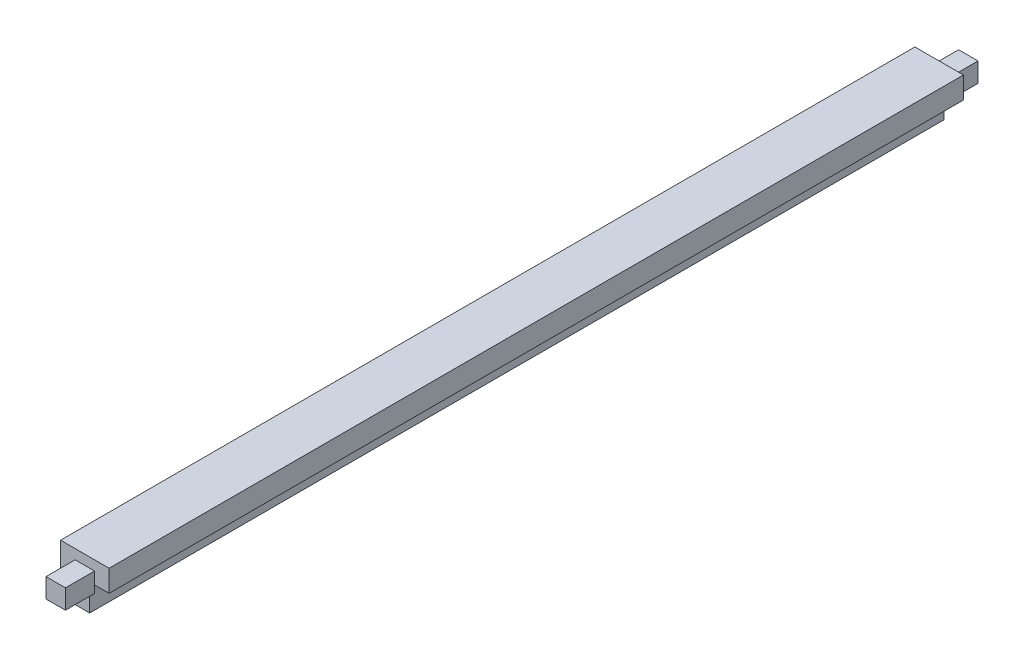
ISO-10303-21;
HEADER;
FILE_DESCRIPTION(('STEP AP214'),'2;1');
FILE_NAME('part.step','',(''),(''),'','','');
FILE_SCHEMA(('AUTOMOTIVE_DESIGN { 1 0 10303 214 1 1 1 1 }'));
ENDSEC;
DATA;
#1=APPLICATION_CONTEXT('core data for automotive mechanical design processes');
#2=APPLICATION_PROTOCOL_DEFINITION('international standard','automotive_design',2000,#1);
#3=PRODUCT_CONTEXT('',#1,'mechanical');
#4=PRODUCT('Part','Part','',(#3));
#5=PRODUCT_RELATED_PRODUCT_CATEGORY('part','',(#4));
#6=PRODUCT_DEFINITION_FORMATION('','',#4);
#7=PRODUCT_DEFINITION_CONTEXT('part definition',#1,'design');
#8=PRODUCT_DEFINITION('design','',#6,#7);
#9=PRODUCT_DEFINITION_SHAPE('','',#8);
#10=(LENGTH_UNIT() NAMED_UNIT(*) SI_UNIT(.MILLI.,.METRE.));
#11=(NAMED_UNIT(*) PLANE_ANGLE_UNIT() SI_UNIT($,.RADIAN.));
#12=(NAMED_UNIT(*) SI_UNIT($,.STERADIAN.) SOLID_ANGLE_UNIT());
#13=UNCERTAINTY_MEASURE_WITH_UNIT(LENGTH_MEASURE(1.E-05),#10,'distance_accuracy_value','');
#14=(GEOMETRIC_REPRESENTATION_CONTEXT(3) GLOBAL_UNCERTAINTY_ASSIGNED_CONTEXT((#13)) GLOBAL_UNIT_ASSIGNED_CONTEXT((#10,
#11,#12)) REPRESENTATION_CONTEXT('',''));
#15=CARTESIAN_POINT('',(0.,0.,0.));
#16=DIRECTION('',(0.,0.,1.));
#17=DIRECTION('',(1.,0.,0.));
#18=AXIS2_PLACEMENT_3D('',#15,#16,#17);
#19=CARTESIAN_POINT('',(-38.944928994695,5.,-32.0723360080208));
#20=DIRECTION('',(0.,0.,1.));
#21=DIRECTION('',(1.,0.,0.));
#22=AXIS2_PLACEMENT_3D('',#19,#20,#21);
#23=PLANE('',#22);
#24=DIRECTION('',(-1.,0.,0.));
#25=VECTOR('',#24,1.);
#26=CARTESIAN_POINT('',(-37.444928994695,2.,-32.0723360080208));
#27=LINE('',#26,#25);
#28=CARTESIAN_POINT('',(-35.944928994695,2.,-32.0723360080208));
#29=VERTEX_POINT('',#28);
#30=CARTESIAN_POINT('',(-37.444928994695,2.,-32.0723360080208));
#31=VERTEX_POINT('',#30);
#32=EDGE_CURVE('E55',#29,#31,#27,.T.);
#33=ORIENTED_EDGE('',*,*,#32,.F.);
#34=DIRECTION('',(0.,-1.,0.));
#35=VECTOR('',#34,1.);
#36=CARTESIAN_POINT('',(-35.944928994695,2.762,-32.0723360080208));
#37=LINE('',#36,#35);
#38=CARTESIAN_POINT('',(-35.944928994695,0.,-32.0723360080208));
#39=VERTEX_POINT('',#38);
#40=EDGE_CURVE('E268',#29,#39,#37,.T.);
#41=ORIENTED_EDGE('',*,*,#40,.T.);
#42=DIRECTION('',(-1.,0.,0.));
#43=VECTOR('',#42,1.);
#44=CARTESIAN_POINT('',(-38.944928994695,0.,-32.0723360080208));
#45=LINE('',#44,#43);
#46=CARTESIAN_POINT('',(-38.944928994695,0.,-32.0723360080208));
#47=VERTEX_POINT('',#46);
#48=EDGE_CURVE('E181',#39,#47,#45,.T.);
#49=ORIENTED_EDGE('',*,*,#48,.T.);
#50=DIRECTION('',(0.,-1.,0.));
#51=VECTOR('',#50,1.);
#52=CARTESIAN_POINT('',(-38.944928994695,5.,-32.0723360080208));
#53=LINE('',#52,#51);
#54=CARTESIAN_POINT('',(-38.944928994695,5.,-32.0723360080208));
#55=VERTEX_POINT('',#54);
#56=EDGE_CURVE('E175',#55,#47,#53,.T.);
#57=ORIENTED_EDGE('',*,*,#56,.F.);
#58=DIRECTION('',(-1.,0.,0.));
#59=VECTOR('',#58,1.);
#60=CARTESIAN_POINT('',(-38.944928994695,5.,-32.0723360080208));
#61=LINE('',#60,#59);
#62=CARTESIAN_POINT('',(-33.944928994695,5.,-32.0723360080208));
#63=VERTEX_POINT('',#62);
#64=EDGE_CURVE('E180',#63,#55,#61,.T.);
#65=ORIENTED_EDGE('',*,*,#64,.F.);
#66=DIRECTION('',(0.,-1.,0.));
#67=VECTOR('',#66,1.);
#68=CARTESIAN_POINT('',(-33.944928994695,5.,-32.0723360080208));
#69=LINE('',#68,#67);
#70=CARTESIAN_POINT('',(-33.944928994695,2.762,-32.0723360080208));
#71=VERTEX_POINT('',#70);
#72=EDGE_CURVE('E174',#63,#71,#69,.T.);
#73=ORIENTED_EDGE('',*,*,#72,.T.);
#74=DIRECTION('',(1.,0.,0.));
#75=VECTOR('',#74,1.);
#76=CARTESIAN_POINT('',(-33.944928994695,2.762,-32.0723360080208));
#77=LINE('',#76,#75);
#78=CARTESIAN_POINT('',(-35.444928994695,2.762,-32.0723360080208));
#79=VERTEX_POINT('',#78);
#80=EDGE_CURVE('E154',#79,#71,#77,.T.);
#81=ORIENTED_EDGE('',*,*,#80,.F.);
#82=DIRECTION('',(0.,-1.,0.));
#83=VECTOR('',#82,1.);
#84=CARTESIAN_POINT('',(-35.444928994695,4.,-32.0723360080208));
#85=LINE('',#84,#83);
#86=CARTESIAN_POINT('',(-35.444928994695,4.,-32.0723360080208));
#87=VERTEX_POINT('',#86);
#88=EDGE_CURVE('E243',#87,#79,#85,.T.);
#89=ORIENTED_EDGE('',*,*,#88,.F.);
#90=DIRECTION('',(1.,0.,0.));
#91=VECTOR('',#90,1.);
#92=CARTESIAN_POINT('',(-37.444928994695,4.,-32.0723360080208));
#93=LINE('',#92,#91);
#94=CARTESIAN_POINT('',(-37.444928994695,4.,-32.0723360080208));
#95=VERTEX_POINT('',#94);
#96=EDGE_CURVE('E246',#95,#87,#93,.T.);
#97=ORIENTED_EDGE('',*,*,#96,.F.);
#98=DIRECTION('',(0.,1.,0.));
#99=VECTOR('',#98,1.);
#100=CARTESIAN_POINT('',(-37.444928994695,4.,-32.0723360080208));
#101=LINE('',#100,#99);
#102=EDGE_CURVE('E249',#31,#95,#101,.T.);
#103=ORIENTED_EDGE('',*,*,#102,.F.);
#104=EDGE_LOOP('',(#33,#41,#49,#57,#65,#73,#81,#89,#97,#103));
#105=FACE_BOUND('',#104,.T.);
#106=ADVANCED_FACE('F32',(#105),#23,.F.);
#107=CARTESIAN_POINT('',(-38.944928994695,5.,55.9276639919792));
#108=DIRECTION('',(0.,0.,-1.));
#109=DIRECTION('',(-1.,0.,0.));
#110=AXIS2_PLACEMENT_3D('',#107,#108,#109);
#111=PLANE('',#110);
#112=DIRECTION('',(1.,0.,0.));
#113=VECTOR('',#112,1.);
#114=CARTESIAN_POINT('',(-38.944928994695,0.,55.9276639919792));
#115=LINE('',#114,#113);
#116=CARTESIAN_POINT('',(-38.944928994695,0.,55.9276639919792));
#117=VERTEX_POINT('',#116);
#118=CARTESIAN_POINT('',(-35.944928994695,0.,55.9276639919792));
#119=VERTEX_POINT('',#118);
#120=EDGE_CURVE('E184',#117,#119,#115,.T.);
#121=ORIENTED_EDGE('',*,*,#120,.T.);
#122=DIRECTION('',(0.,-1.,0.));
#123=VECTOR('',#122,1.);
#124=CARTESIAN_POINT('',(-35.944928994695,2.762,55.9276639919792));
#125=LINE('',#124,#123);
#126=CARTESIAN_POINT('',(-35.944928994695,2.,55.9276639919792));
#127=VERTEX_POINT('',#126);
#128=EDGE_CURVE('E269',#127,#119,#125,.T.);
#129=ORIENTED_EDGE('',*,*,#128,.F.);
#130=DIRECTION('',(1.,0.,0.));
#131=VECTOR('',#130,1.);
#132=CARTESIAN_POINT('',(-37.444928994695,2.,55.9276639919792));
#133=LINE('',#132,#131);
#134=CARTESIAN_POINT('',(-37.444928994695,2.,55.9276639919792));
#135=VERTEX_POINT('',#134);
#136=EDGE_CURVE('E214',#135,#127,#133,.T.);
#137=ORIENTED_EDGE('',*,*,#136,.F.);
#138=DIRECTION('',(0.,-1.,0.));
#139=VECTOR('',#138,1.);
#140=CARTESIAN_POINT('',(-37.444928994695,4.,55.9276639919792));
#141=LINE('',#140,#139);
#142=CARTESIAN_POINT('',(-37.444928994695,4.,55.9276639919792));
#143=VERTEX_POINT('',#142);
#144=EDGE_CURVE('E217',#143,#135,#141,.T.);
#145=ORIENTED_EDGE('',*,*,#144,.F.);
#146=DIRECTION('',(-1.,0.,0.));
#147=VECTOR('',#146,1.);
#148=CARTESIAN_POINT('',(-37.444928994695,4.,55.9276639919792));
#149=LINE('',#148,#147);
#150=CARTESIAN_POINT('',(-35.444928994695,4.,55.9276639919792));
#151=VERTEX_POINT('',#150);
#152=EDGE_CURVE('E208',#151,#143,#149,.T.);
#153=ORIENTED_EDGE('',*,*,#152,.F.);
#154=DIRECTION('',(0.,1.,0.));
#155=VECTOR('',#154,1.);
#156=CARTESIAN_POINT('',(-35.444928994695,4.,55.9276639919792));
#157=LINE('',#156,#155);
#158=CARTESIAN_POINT('',(-35.444928994695,2.762,55.9276639919792));
#159=VERTEX_POINT('',#158);
#160=EDGE_CURVE('E168',#159,#151,#157,.T.);
#161=ORIENTED_EDGE('',*,*,#160,.F.);
#162=DIRECTION('',(-1.,0.,0.));
#163=VECTOR('',#162,1.);
#164=CARTESIAN_POINT('',(-33.944928994695,2.762,55.9276639919792));
#165=LINE('',#164,#163);
#166=CARTESIAN_POINT('',(-33.944928994695,2.762,55.9276639919792));
#167=VERTEX_POINT('',#166);
#168=EDGE_CURVE('E150',#167,#159,#165,.T.);
#169=ORIENTED_EDGE('',*,*,#168,.F.);
#170=DIRECTION('',(0.,-1.,0.));
#171=VECTOR('',#170,1.);
#172=CARTESIAN_POINT('',(-33.944928994695,5.,55.9276639919792));
#173=LINE('',#172,#171);
#174=CARTESIAN_POINT('',(-33.944928994695,5.,55.9276639919792));
#175=VERTEX_POINT('',#174);
#176=EDGE_CURVE('E40',#175,#167,#173,.T.);
#177=ORIENTED_EDGE('',*,*,#176,.F.);
#178=DIRECTION('',(1.,0.,0.));
#179=VECTOR('',#178,1.);
#180=CARTESIAN_POINT('',(-38.944928994695,5.,55.9276639919792));
#181=LINE('',#180,#179);
#182=CARTESIAN_POINT('',(-38.944928994695,5.,55.9276639919792));
#183=VERTEX_POINT('',#182);
#184=EDGE_CURVE('E192',#183,#175,#181,.T.);
#185=ORIENTED_EDGE('',*,*,#184,.F.);
#186=DIRECTION('',(0.,-1.,0.));
#187=VECTOR('',#186,1.);
#188=CARTESIAN_POINT('',(-38.944928994695,5.,55.9276639919792));
#189=LINE('',#188,#187);
#190=EDGE_CURVE('E11',#183,#117,#189,.T.);
#191=ORIENTED_EDGE('',*,*,#190,.T.);
#192=EDGE_LOOP('',(#121,#129,#137,#145,#153,#161,#169,#177,#185,#191));
#193=FACE_BOUND('',#192,.T.);
#194=ADVANCED_FACE('F165',(#193),#111,.F.);
#195=CARTESIAN_POINT('',(-38.944928994695,5.,-32.0723360080208));
#196=DIRECTION('',(1.,0.,0.));
#197=DIRECTION('',(0.,0.,-1.));
#198=AXIS2_PLACEMENT_3D('',#195,#196,#197);
#199=PLANE('',#198);
#200=DIRECTION('',(0.,0.,1.));
#201=VECTOR('',#200,1.);
#202=CARTESIAN_POINT('',(-38.944928994695,0.,-32.0723360080208));
#203=LINE('',#202,#201);
#204=EDGE_CURVE('E186',#47,#117,#203,.T.);
#205=ORIENTED_EDGE('',*,*,#204,.T.);
#206=ORIENTED_EDGE('',*,*,#190,.F.);
#207=DIRECTION('',(0.,0.,1.));
#208=VECTOR('',#207,1.);
#209=CARTESIAN_POINT('',(-38.944928994695,5.,-32.0723360080208));
#210=LINE('',#209,#208);
#211=EDGE_CURVE('E183',#55,#183,#210,.T.);
#212=ORIENTED_EDGE('',*,*,#211,.F.);
#213=ORIENTED_EDGE('',*,*,#56,.T.);
#214=EDGE_LOOP('',(#205,#206,#212,#213));
#215=FACE_BOUND('',#214,.T.);
#216=ADVANCED_FACE('F34',(#215),#199,.F.);
#217=CARTESIAN_POINT('',(-33.944928994695,5.,-32.0723360080208));
#218=DIRECTION('',(-1.,0.,0.));
#219=DIRECTION('',(0.,0.,1.));
#220=AXIS2_PLACEMENT_3D('',#217,#218,#219);
#221=PLANE('',#220);
#222=ORIENTED_EDGE('',*,*,#176,.T.);
#223=DIRECTION('',(0.,0.,1.));
#224=VECTOR('',#223,1.);
#225=CARTESIAN_POINT('',(-33.944928994695,2.762,55.9276639919792));
#226=LINE('',#225,#224);
#227=EDGE_CURVE('E147',#71,#167,#226,.T.);
#228=ORIENTED_EDGE('',*,*,#227,.F.);
#229=ORIENTED_EDGE('',*,*,#72,.F.);
#230=DIRECTION('',(0.,0.,-1.));
#231=VECTOR('',#230,1.);
#232=CARTESIAN_POINT('',(-33.944928994695,5.,-32.0723360080208));
#233=LINE('',#232,#231);
#234=EDGE_CURVE('E173',#175,#63,#233,.T.);
#235=ORIENTED_EDGE('',*,*,#234,.F.);
#236=EDGE_LOOP('',(#222,#228,#229,#235));
#237=FACE_BOUND('',#236,.T.);
#238=ADVANCED_FACE('F172',(#237),#221,.F.);
#239=CARTESIAN_POINT('',(0.,5.,0.));
#240=DIRECTION('',(0.,1.,0.));
#241=DIRECTION('',(0.,0.,1.));
#242=AXIS2_PLACEMENT_3D('',#239,#240,#241);
#243=PLANE('',#242);
#244=ORIENTED_EDGE('',*,*,#211,.T.);
#245=ORIENTED_EDGE('',*,*,#184,.T.);
#246=ORIENTED_EDGE('',*,*,#234,.T.);
#247=ORIENTED_EDGE('',*,*,#64,.T.);
#248=EDGE_LOOP('',(#244,#245,#246,#247));
#249=FACE_BOUND('',#248,.T.);
#250=ADVANCED_FACE('F297',(#249),#243,.T.);
#251=CARTESIAN_POINT('',(0.,0.,0.));
#252=DIRECTION('',(0.,1.,0.));
#253=DIRECTION('',(0.,0.,1.));
#254=AXIS2_PLACEMENT_3D('',#251,#252,#253);
#255=PLANE('',#254);
#256=ORIENTED_EDGE('',*,*,#48,.F.);
#257=DIRECTION('',(0.,0.,-1.));
#258=VECTOR('',#257,1.);
#259=CARTESIAN_POINT('',(-35.944928994695,0.,55.9276639919792));
#260=LINE('',#259,#258);
#261=EDGE_CURVE('E160',#119,#39,#260,.T.);
#262=ORIENTED_EDGE('',*,*,#261,.F.);
#263=ORIENTED_EDGE('',*,*,#120,.F.);
#264=ORIENTED_EDGE('',*,*,#204,.F.);
#265=EDGE_LOOP('',(#256,#262,#263,#264));
#266=FACE_BOUND('',#265,.T.);
#267=ADVANCED_FACE('F304',(#266),#255,.F.);
#268=CARTESIAN_POINT('',(-37.444928994695,4.,58.9276639919792));
#269=DIRECTION('',(1.,0.,0.));
#270=DIRECTION('',(0.,0.,-1.));
#271=AXIS2_PLACEMENT_3D('',#268,#269,#270);
#272=PLANE('',#271);
#273=ORIENTED_EDGE('',*,*,#144,.T.);
#274=DIRECTION('',(0.,0.,-1.));
#275=VECTOR('',#274,1.);
#276=CARTESIAN_POINT('',(-37.444928994695,2.,58.9276639919792));
#277=LINE('',#276,#275);
#278=CARTESIAN_POINT('',(-37.444928994695,2.,58.9276639919792));
#279=VERTEX_POINT('',#278);
#280=EDGE_CURVE('E189',#279,#135,#277,.T.);
#281=ORIENTED_EDGE('',*,*,#280,.F.);
#282=DIRECTION('',(0.,-1.,0.));
#283=VECTOR('',#282,1.);
#284=CARTESIAN_POINT('',(-37.444928994695,4.,58.9276639919792));
#285=LINE('',#284,#283);
#286=CARTESIAN_POINT('',(-37.444928994695,4.,58.9276639919792));
#287=VERTEX_POINT('',#286);
#288=EDGE_CURVE('E211',#287,#279,#285,.T.);
#289=ORIENTED_EDGE('',*,*,#288,.F.);
#290=DIRECTION('',(0.,0.,-1.));
#291=VECTOR('',#290,1.);
#292=CARTESIAN_POINT('',(-37.444928994695,4.,58.9276639919792));
#293=LINE('',#292,#291);
#294=EDGE_CURVE('E204',#287,#143,#293,.T.);
#295=ORIENTED_EDGE('',*,*,#294,.T.);
#296=EDGE_LOOP('',(#273,#281,#289,#295));
#297=FACE_BOUND('',#296,.T.);
#298=ADVANCED_FACE('F314',(#297),#272,.F.);
#299=CARTESIAN_POINT('',(-37.444928994695,2.,58.9276639919792));
#300=DIRECTION('',(0.,1.,0.));
#301=DIRECTION('',(0.,0.,1.));
#302=AXIS2_PLACEMENT_3D('',#299,#300,#301);
#303=PLANE('',#302);
#304=ORIENTED_EDGE('',*,*,#136,.T.);
#305=DIRECTION('',(1.,0.,0.));
#306=VECTOR('',#305,1.);
#307=CARTESIAN_POINT('',(-37.444928994695,2.,55.9276639919792));
#308=LINE('',#307,#306);
#309=CARTESIAN_POINT('',(-35.444928994695,2.,55.9276639919792));
#310=VERTEX_POINT('',#309);
#311=EDGE_CURVE('E252',#127,#310,#308,.T.);
#312=ORIENTED_EDGE('',*,*,#311,.T.);
#313=DIRECTION('',(0.,0.,-1.));
#314=VECTOR('',#313,1.);
#315=CARTESIAN_POINT('',(-35.444928994695,2.,58.9276639919792));
#316=LINE('',#315,#314);
#317=CARTESIAN_POINT('',(-35.444928994695,2.,58.9276639919792));
#318=VERTEX_POINT('',#317);
#319=EDGE_CURVE('E198',#318,#310,#316,.T.);
#320=ORIENTED_EDGE('',*,*,#319,.F.);
#321=DIRECTION('',(1.,0.,0.));
#322=VECTOR('',#321,1.);
#323=CARTESIAN_POINT('',(-37.444928994695,2.,58.9276639919792));
#324=LINE('',#323,#322);
#325=EDGE_CURVE('E224',#279,#318,#324,.T.);
#326=ORIENTED_EDGE('',*,*,#325,.F.);
#327=ORIENTED_EDGE('',*,*,#280,.T.);
#328=EDGE_LOOP('',(#304,#312,#320,#326,#327));
#329=FACE_BOUND('',#328,.T.);
#330=ADVANCED_FACE('F309',(#329),#303,.F.);
#331=CARTESIAN_POINT('',(-35.444928994695,4.,58.9276639919792));
#332=DIRECTION('',(-1.,0.,0.));
#333=DIRECTION('',(0.,0.,1.));
#334=AXIS2_PLACEMENT_3D('',#331,#332,#333);
#335=PLANE('',#334);
#336=EDGE_CURVE('E212',#310,#159,#157,.T.);
#337=ORIENTED_EDGE('',*,*,#336,.T.);
#338=ORIENTED_EDGE('',*,*,#160,.T.);
#339=DIRECTION('',(0.,0.,-1.));
#340=VECTOR('',#339,1.);
#341=CARTESIAN_POINT('',(-35.444928994695,4.,58.9276639919792));
#342=LINE('',#341,#340);
#343=CARTESIAN_POINT('',(-35.444928994695,4.,58.9276639919792));
#344=VERTEX_POINT('',#343);
#345=EDGE_CURVE('E201',#344,#151,#342,.T.);
#346=ORIENTED_EDGE('',*,*,#345,.F.);
#347=DIRECTION('',(0.,1.,0.));
#348=VECTOR('',#347,1.);
#349=CARTESIAN_POINT('',(-35.444928994695,4.,58.9276639919792));
#350=LINE('',#349,#348);
#351=EDGE_CURVE('E222',#318,#344,#350,.T.);
#352=ORIENTED_EDGE('',*,*,#351,.F.);
#353=ORIENTED_EDGE('',*,*,#319,.T.);
#354=EDGE_LOOP('',(#337,#338,#346,#352,#353));
#355=FACE_BOUND('',#354,.T.);
#356=ADVANCED_FACE('F322',(#355),#335,.F.);
#357=CARTESIAN_POINT('',(-37.444928994695,4.,58.9276639919792));
#358=DIRECTION('',(0.,-1.,0.));
#359=DIRECTION('',(0.,0.,-1.));
#360=AXIS2_PLACEMENT_3D('',#357,#358,#359);
#361=PLANE('',#360);
#362=ORIENTED_EDGE('',*,*,#152,.T.);
#363=ORIENTED_EDGE('',*,*,#294,.F.);
#364=DIRECTION('',(-1.,0.,0.));
#365=VECTOR('',#364,1.);
#366=CARTESIAN_POINT('',(-37.444928994695,4.,58.9276639919792));
#367=LINE('',#366,#365);
#368=EDGE_CURVE('E207',#344,#287,#367,.T.);
#369=ORIENTED_EDGE('',*,*,#368,.F.);
#370=ORIENTED_EDGE('',*,*,#345,.T.);
#371=EDGE_LOOP('',(#362,#363,#369,#370));
#372=FACE_BOUND('',#371,.T.);
#373=ADVANCED_FACE('F317',(#372),#361,.F.);
#374=CARTESIAN_POINT('',(0.,0.,58.9276639919792));
#375=DIRECTION('',(0.,0.,1.));
#376=DIRECTION('',(1.,0.,0.));
#377=AXIS2_PLACEMENT_3D('',#374,#375,#376);
#378=PLANE('',#377);
#379=ORIENTED_EDGE('',*,*,#288,.T.);
#380=ORIENTED_EDGE('',*,*,#325,.T.);
#381=ORIENTED_EDGE('',*,*,#351,.T.);
#382=ORIENTED_EDGE('',*,*,#368,.T.);
#383=EDGE_LOOP('',(#379,#380,#381,#382));
#384=FACE_BOUND('',#383,.T.);
#385=ADVANCED_FACE('F453',(#384),#378,.T.);
#386=CARTESIAN_POINT('',(-37.444928994695,4.,-35.0723360080208));
#387=DIRECTION('',(1.,0.,0.));
#388=DIRECTION('',(0.,0.,-1.));
#389=AXIS2_PLACEMENT_3D('',#386,#387,#388);
#390=PLANE('',#389);
#391=ORIENTED_EDGE('',*,*,#102,.T.);
#392=DIRECTION('',(0.,0.,1.));
#393=VECTOR('',#392,1.);
#394=CARTESIAN_POINT('',(-37.444928994695,4.,-35.0723360080208));
#395=LINE('',#394,#393);
#396=CARTESIAN_POINT('',(-37.444928994695,4.,-35.0723360080208));
#397=VERTEX_POINT('',#396);
#398=EDGE_CURVE('E220',#397,#95,#395,.T.);
#399=ORIENTED_EDGE('',*,*,#398,.F.);
#400=DIRECTION('',(0.,1.,0.));
#401=VECTOR('',#400,1.);
#402=CARTESIAN_POINT('',(-37.444928994695,4.,-35.0723360080208));
#403=LINE('',#402,#401);
#404=CARTESIAN_POINT('',(-37.444928994695,2.,-35.0723360080208));
#405=VERTEX_POINT('',#404);
#406=EDGE_CURVE('E242',#405,#397,#403,.T.);
#407=ORIENTED_EDGE('',*,*,#406,.F.);
#408=DIRECTION('',(0.,0.,1.));
#409=VECTOR('',#408,1.);
#410=CARTESIAN_POINT('',(-37.444928994695,2.,-35.0723360080208));
#411=LINE('',#410,#409);
#412=EDGE_CURVE('E236',#405,#31,#411,.T.);
#413=ORIENTED_EDGE('',*,*,#412,.T.);
#414=EDGE_LOOP('',(#391,#399,#407,#413));
#415=FACE_BOUND('',#414,.T.);
#416=ADVANCED_FACE('F444',(#415),#390,.F.);
#417=CARTESIAN_POINT('',(-37.444928994695,4.,-35.0723360080208));
#418=DIRECTION('',(0.,-1.,0.));
#419=DIRECTION('',(0.,0.,-1.));
#420=AXIS2_PLACEMENT_3D('',#417,#418,#419);
#421=PLANE('',#420);
#422=ORIENTED_EDGE('',*,*,#96,.T.);
#423=DIRECTION('',(0.,0.,1.));
#424=VECTOR('',#423,1.);
#425=CARTESIAN_POINT('',(-35.444928994695,4.,-35.0723360080208));
#426=LINE('',#425,#424);
#427=CARTESIAN_POINT('',(-35.444928994695,4.,-35.0723360080208));
#428=VERTEX_POINT('',#427);
#429=EDGE_CURVE('E230',#428,#87,#426,.T.);
#430=ORIENTED_EDGE('',*,*,#429,.F.);
#431=DIRECTION('',(1.,0.,0.));
#432=VECTOR('',#431,1.);
#433=CARTESIAN_POINT('',(-37.444928994695,4.,-35.0723360080208));
#434=LINE('',#433,#432);
#435=EDGE_CURVE('E256',#397,#428,#434,.T.);
#436=ORIENTED_EDGE('',*,*,#435,.F.);
#437=ORIENTED_EDGE('',*,*,#398,.T.);
#438=EDGE_LOOP('',(#422,#430,#436,#437));
#439=FACE_BOUND('',#438,.T.);
#440=ADVANCED_FACE('F291',(#439),#421,.F.);
#441=CARTESIAN_POINT('',(-35.444928994695,4.,-35.0723360080208));
#442=DIRECTION('',(-1.,0.,0.));
#443=DIRECTION('',(0.,0.,1.));
#444=AXIS2_PLACEMENT_3D('',#441,#442,#443);
#445=PLANE('',#444);
#446=ORIENTED_EDGE('',*,*,#88,.T.);
#447=DIRECTION('',(0.,-1.,0.));
#448=VECTOR('',#447,1.);
#449=CARTESIAN_POINT('',(-35.444928994695,4.,-32.0723360080208));
#450=LINE('',#449,#448);
#451=CARTESIAN_POINT('',(-35.444928994695,2.,-32.0723360080208));
#452=VERTEX_POINT('',#451);
#453=EDGE_CURVE('E262',#79,#452,#450,.T.);
#454=ORIENTED_EDGE('',*,*,#453,.T.);
#455=DIRECTION('',(0.,0.,1.));
#456=VECTOR('',#455,1.);
#457=CARTESIAN_POINT('',(-35.444928994695,2.,-35.0723360080208));
#458=LINE('',#457,#456);
#459=CARTESIAN_POINT('',(-35.444928994695,2.,-35.0723360080208));
#460=VERTEX_POINT('',#459);
#461=EDGE_CURVE('E233',#460,#452,#458,.T.);
#462=ORIENTED_EDGE('',*,*,#461,.F.);
#463=DIRECTION('',(0.,-1.,0.));
#464=VECTOR('',#463,1.);
#465=CARTESIAN_POINT('',(-35.444928994695,4.,-35.0723360080208));
#466=LINE('',#465,#464);
#467=EDGE_CURVE('E254',#428,#460,#466,.T.);
#468=ORIENTED_EDGE('',*,*,#467,.F.);
#469=ORIENTED_EDGE('',*,*,#429,.T.);
#470=EDGE_LOOP('',(#446,#454,#462,#468,#469));
#471=FACE_BOUND('',#470,.T.);
#472=ADVANCED_FACE('F281',(#471),#445,.F.);
#473=CARTESIAN_POINT('',(-37.444928994695,2.,-35.0723360080208));
#474=DIRECTION('',(0.,1.,0.));
#475=DIRECTION('',(0.,0.,1.));
#476=AXIS2_PLACEMENT_3D('',#473,#474,#475);
#477=PLANE('',#476);
#478=EDGE_CURVE('E240',#452,#29,#27,.T.);
#479=ORIENTED_EDGE('',*,*,#478,.T.);
#480=ORIENTED_EDGE('',*,*,#32,.T.);
#481=ORIENTED_EDGE('',*,*,#412,.F.);
#482=DIRECTION('',(-1.,0.,0.));
#483=VECTOR('',#482,1.);
#484=CARTESIAN_POINT('',(-37.444928994695,2.,-35.0723360080208));
#485=LINE('',#484,#483);
#486=EDGE_CURVE('E239',#460,#405,#485,.T.);
#487=ORIENTED_EDGE('',*,*,#486,.F.);
#488=ORIENTED_EDGE('',*,*,#461,.T.);
#489=EDGE_LOOP('',(#479,#480,#481,#487,#488));
#490=FACE_BOUND('',#489,.T.);
#491=ADVANCED_FACE('F284',(#490),#477,.F.);
#492=CARTESIAN_POINT('',(0.,0.,-35.0723360080208));
#493=DIRECTION('',(0.,0.,1.));
#494=DIRECTION('',(1.,0.,0.));
#495=AXIS2_PLACEMENT_3D('',#492,#493,#494);
#496=PLANE('',#495);
#497=ORIENTED_EDGE('',*,*,#406,.T.);
#498=ORIENTED_EDGE('',*,*,#435,.T.);
#499=ORIENTED_EDGE('',*,*,#467,.T.);
#500=ORIENTED_EDGE('',*,*,#486,.T.);
#501=EDGE_LOOP('',(#497,#498,#499,#500));
#502=FACE_BOUND('',#501,.T.);
#503=ADVANCED_FACE('F287',(#502),#496,.F.);
#504=CARTESIAN_POINT('',(-33.944928994695,2.762,55.9276639919792));
#505=DIRECTION('',(0.,0.,1.));
#506=DIRECTION('',(1.,0.,0.));
#507=AXIS2_PLACEMENT_3D('',#504,#505,#506);
#508=PLANE('',#507);
#509=CARTESIAN_POINT('',(-35.944928994695,2.762,55.9276639919792));
#510=VERTEX_POINT('',#509);
#511=EDGE_CURVE('E265',#510,#127,#125,.T.);
#512=ORIENTED_EDGE('',*,*,#511,.F.);
#513=EDGE_CURVE('E159',#159,#510,#165,.T.);
#514=ORIENTED_EDGE('',*,*,#513,.F.);
#515=ORIENTED_EDGE('',*,*,#336,.F.);
#516=ORIENTED_EDGE('',*,*,#311,.F.);
#517=EDGE_LOOP('',(#512,#514,#515,#516));
#518=FACE_BOUND('',#517,.T.);
#519=ADVANCED_FACE('F324',(#518),#508,.F.);
#520=CARTESIAN_POINT('',(-33.944928994695,2.762,-32.0723360080208));
#521=DIRECTION('',(0.,0.,-1.));
#522=DIRECTION('',(-1.,0.,0.));
#523=AXIS2_PLACEMENT_3D('',#520,#521,#522);
#524=PLANE('',#523);
#525=CARTESIAN_POINT('',(-35.944928994695,2.762,-32.0723360080208));
#526=VERTEX_POINT('',#525);
#527=EDGE_CURVE('E272',#526,#79,#77,.T.);
#528=ORIENTED_EDGE('',*,*,#527,.F.);
#529=EDGE_CURVE('E47',#526,#29,#37,.T.);
#530=ORIENTED_EDGE('',*,*,#529,.T.);
#531=ORIENTED_EDGE('',*,*,#478,.F.);
#532=ORIENTED_EDGE('',*,*,#453,.F.);
#533=EDGE_LOOP('',(#528,#530,#531,#532));
#534=FACE_BOUND('',#533,.T.);
#535=ADVANCED_FACE('F278',(#534),#524,.F.);
#536=CARTESIAN_POINT('',(-35.944928994695,2.762,55.9276639919792));
#537=DIRECTION('',(-1.,0.,0.));
#538=DIRECTION('',(0.,0.,1.));
#539=AXIS2_PLACEMENT_3D('',#536,#537,#538);
#540=PLANE('',#539);
#541=ORIENTED_EDGE('',*,*,#261,.T.);
#542=ORIENTED_EDGE('',*,*,#40,.F.);
#543=ORIENTED_EDGE('',*,*,#529,.F.);
#544=DIRECTION('',(0.,0.,-1.));
#545=VECTOR('',#544,1.);
#546=CARTESIAN_POINT('',(-35.944928994695,2.762,55.9276639919792));
#547=LINE('',#546,#545);
#548=EDGE_CURVE('E170',#510,#526,#547,.T.);
#549=ORIENTED_EDGE('',*,*,#548,.F.);
#550=ORIENTED_EDGE('',*,*,#511,.T.);
#551=ORIENTED_EDGE('',*,*,#128,.T.);
#552=EDGE_LOOP('',(#541,#542,#543,#549,#550,#551));
#553=FACE_BOUND('',#552,.T.);
#554=ADVANCED_FACE('F307',(#553),#540,.F.);
#555=CARTESIAN_POINT('',(0.,2.762,0.));
#556=DIRECTION('',(0.,1.,0.));
#557=DIRECTION('',(0.,0.,1.));
#558=AXIS2_PLACEMENT_3D('',#555,#556,#557);
#559=PLANE('',#558);
#560=ORIENTED_EDGE('',*,*,#227,.T.);
#561=ORIENTED_EDGE('',*,*,#168,.T.);
#562=ORIENTED_EDGE('',*,*,#513,.T.);
#563=ORIENTED_EDGE('',*,*,#548,.T.);
#564=ORIENTED_EDGE('',*,*,#527,.T.);
#565=ORIENTED_EDGE('',*,*,#80,.T.);
#566=EDGE_LOOP('',(#560,#561,#562,#563,#564,#565));
#567=FACE_BOUND('',#566,.T.);
#568=ADVANCED_FACE('F149',(#567),#559,.F.);
#569=CLOSED_SHELL('',(#106,#194,#216,#238,#250,#267,#298,#330,#356,#373,#385,#416,#440,#472,
#491,#503,#519,#535,#554,#568));
#570=MANIFOLD_SOLID_BREP('B2',#569);
#571=ADVANCED_BREP_SHAPE_REPRESENTATION('',(#18,#570),#14);
#572=SHAPE_DEFINITION_REPRESENTATION(#9,#571);
ENDSEC;
END-ISO-10303-21;
